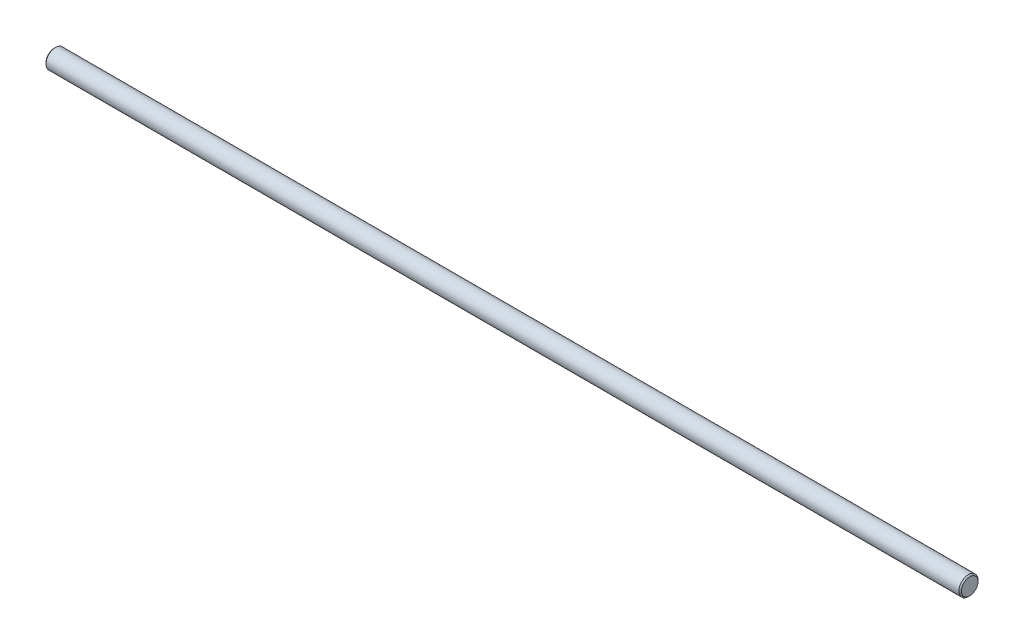
ISO-10303-21;
HEADER;
FILE_DESCRIPTION(('STEP AP214'),'2;1');
FILE_NAME('part.step','',(''),(''),'','','');
FILE_SCHEMA(('AUTOMOTIVE_DESIGN { 1 0 10303 214 1 1 1 1 }'));
ENDSEC;
DATA;
#1=APPLICATION_CONTEXT('core data for automotive mechanical design processes');
#2=APPLICATION_PROTOCOL_DEFINITION('international standard','automotive_design',2000,#1);
#3=PRODUCT_CONTEXT('',#1,'mechanical');
#4=PRODUCT('Part','Part','',(#3));
#5=PRODUCT_RELATED_PRODUCT_CATEGORY('part','',(#4));
#6=PRODUCT_DEFINITION_FORMATION('','',#4);
#7=PRODUCT_DEFINITION_CONTEXT('part definition',#1,'design');
#8=PRODUCT_DEFINITION('design','',#6,#7);
#9=PRODUCT_DEFINITION_SHAPE('','',#8);
#10=(LENGTH_UNIT() NAMED_UNIT(*) SI_UNIT(.MILLI.,.METRE.));
#11=(NAMED_UNIT(*) PLANE_ANGLE_UNIT() SI_UNIT($,.RADIAN.));
#12=(NAMED_UNIT(*) SI_UNIT($,.STERADIAN.) SOLID_ANGLE_UNIT());
#13=UNCERTAINTY_MEASURE_WITH_UNIT(LENGTH_MEASURE(1.E-05),#10,'distance_accuracy_value','');
#14=(GEOMETRIC_REPRESENTATION_CONTEXT(3) GLOBAL_UNCERTAINTY_ASSIGNED_CONTEXT((#13)) GLOBAL_UNIT_ASSIGNED_CONTEXT((#10,
#11,#12)) REPRESENTATION_CONTEXT('',''));
#15=CARTESIAN_POINT('',(0.,0.,0.));
#16=DIRECTION('',(0.,0.,1.));
#17=DIRECTION('',(1.,0.,0.));
#18=AXIS2_PLACEMENT_3D('',#15,#16,#17);
#19=CARTESIAN_POINT('',(457.2,0.,0.));
#20=DIRECTION('',(-1.,0.,0.));
#21=DIRECTION('',(0.,0.,1.));
#22=AXIS2_PLACEMENT_3D('',#19,#20,#21);
#23=CYLINDRICAL_SURFACE('',#22,9.525);
#24=CARTESIAN_POINT('',(455.93,0.,0.));
#25=DIRECTION('',(1.,0.,0.));
#26=DIRECTION('',(0.,0.,-1.));
#27=AXIS2_PLACEMENT_3D('',#24,#25,#26);
#28=CIRCLE('',#27,9.525);
#29=CARTESIAN_POINT('',(455.93,0.,-9.525));
#30=VERTEX_POINT('',#29);
#31=EDGE_CURVE('E51',#30,#30,#28,.F.);
#32=ORIENTED_EDGE('',*,*,#31,.T.);
#33=EDGE_LOOP('',(#32));
#34=FACE_BOUND('',#33,.T.);
#35=CARTESIAN_POINT('',(-455.93,0.,0.));
#36=DIRECTION('',(1.,0.,0.));
#37=DIRECTION('',(0.,0.,-1.));
#38=AXIS2_PLACEMENT_3D('',#35,#36,#37);
#39=CIRCLE('',#38,9.525);
#40=CARTESIAN_POINT('',(-455.93,0.,-9.525));
#41=VERTEX_POINT('',#40);
#42=EDGE_CURVE('E55',#41,#41,#39,.T.);
#43=ORIENTED_EDGE('',*,*,#42,.T.);
#44=EDGE_LOOP('',(#43));
#45=FACE_BOUND('',#44,.T.);
#46=ADVANCED_FACE('F44',(#34,#45),#23,.T.);
#47=CARTESIAN_POINT('',(457.2,0.,0.));
#48=DIRECTION('',(1.,0.,0.));
#49=DIRECTION('',(0.,0.,-1.));
#50=AXIS2_PLACEMENT_3D('',#47,#48,#49);
#51=PLANE('',#50);
#52=CARTESIAN_POINT('',(457.2,0.,0.));
#53=DIRECTION('',(1.,0.,0.));
#54=DIRECTION('',(0.,0.,-1.));
#55=AXIS2_PLACEMENT_3D('',#52,#53,#54);
#56=CIRCLE('',#55,8.25500000000001);
#57=CARTESIAN_POINT('',(457.2,0.,-8.25500000000001));
#58=VERTEX_POINT('',#57);
#59=EDGE_CURVE('E59',#58,#58,#56,.T.);
#60=ORIENTED_EDGE('',*,*,#59,.T.);
#61=EDGE_LOOP('',(#60));
#62=FACE_BOUND('',#61,.T.);
#63=ADVANCED_FACE('F65',(#62),#51,.T.);
#64=CARTESIAN_POINT('',(-457.2,0.,0.));
#65=DIRECTION('',(1.,0.,0.));
#66=DIRECTION('',(0.,0.,-1.));
#67=AXIS2_PLACEMENT_3D('',#64,#65,#66);
#68=PLANE('',#67);
#69=CARTESIAN_POINT('',(-457.2,0.,0.));
#70=DIRECTION('',(1.,0.,0.));
#71=DIRECTION('',(0.,0.,-1.));
#72=AXIS2_PLACEMENT_3D('',#69,#70,#71);
#73=CIRCLE('',#72,8.25500000000001);
#74=CARTESIAN_POINT('',(-457.2,0.,-8.25500000000001));
#75=VERTEX_POINT('',#74);
#76=EDGE_CURVE('E12',#75,#75,#73,.F.);
#77=ORIENTED_EDGE('',*,*,#76,.T.);
#78=EDGE_LOOP('',(#77));
#79=FACE_BOUND('',#78,.T.);
#80=ADVANCED_FACE('F69',(#79),#68,.F.);
#81=CARTESIAN_POINT('',(457.2,0.,0.));
#82=DIRECTION('',(-1.,0.,0.));
#83=DIRECTION('',(0.,0.,1.));
#84=AXIS2_PLACEMENT_3D('',#81,#82,#83);
#85=CONICAL_SURFACE('',#84,8.25500000000001,0.785398163397424);
#86=ORIENTED_EDGE('',*,*,#31,.F.);
#87=EDGE_LOOP('',(#86));
#88=FACE_BOUND('',#87,.T.);
#89=ORIENTED_EDGE('',*,*,#59,.F.);
#90=EDGE_LOOP('',(#89));
#91=FACE_BOUND('',#90,.T.);
#92=ADVANCED_FACE('F67',(#88,#91),#85,.T.);
#93=CARTESIAN_POINT('',(-455.93,0.,0.));
#94=DIRECTION('',(1.,0.,0.));
#95=DIRECTION('',(0.,0.,-1.));
#96=AXIS2_PLACEMENT_3D('',#93,#94,#95);
#97=CONICAL_SURFACE('',#96,9.525,0.785398163397446);
#98=ORIENTED_EDGE('',*,*,#76,.F.);
#99=EDGE_LOOP('',(#98));
#100=FACE_BOUND('',#99,.T.);
#101=ORIENTED_EDGE('',*,*,#42,.F.);
#102=EDGE_LOOP('',(#101));
#103=FACE_BOUND('',#102,.T.);
#104=ADVANCED_FACE('F46',(#100,#103),#97,.T.);
#105=CLOSED_SHELL('',(#46,#63,#80,#92,#104));
#106=MANIFOLD_SOLID_BREP('B2',#105);
#107=ADVANCED_BREP_SHAPE_REPRESENTATION('',(#18,#106),#14);
#108=SHAPE_DEFINITION_REPRESENTATION(#9,#107);
ENDSEC;
END-ISO-10303-21;
